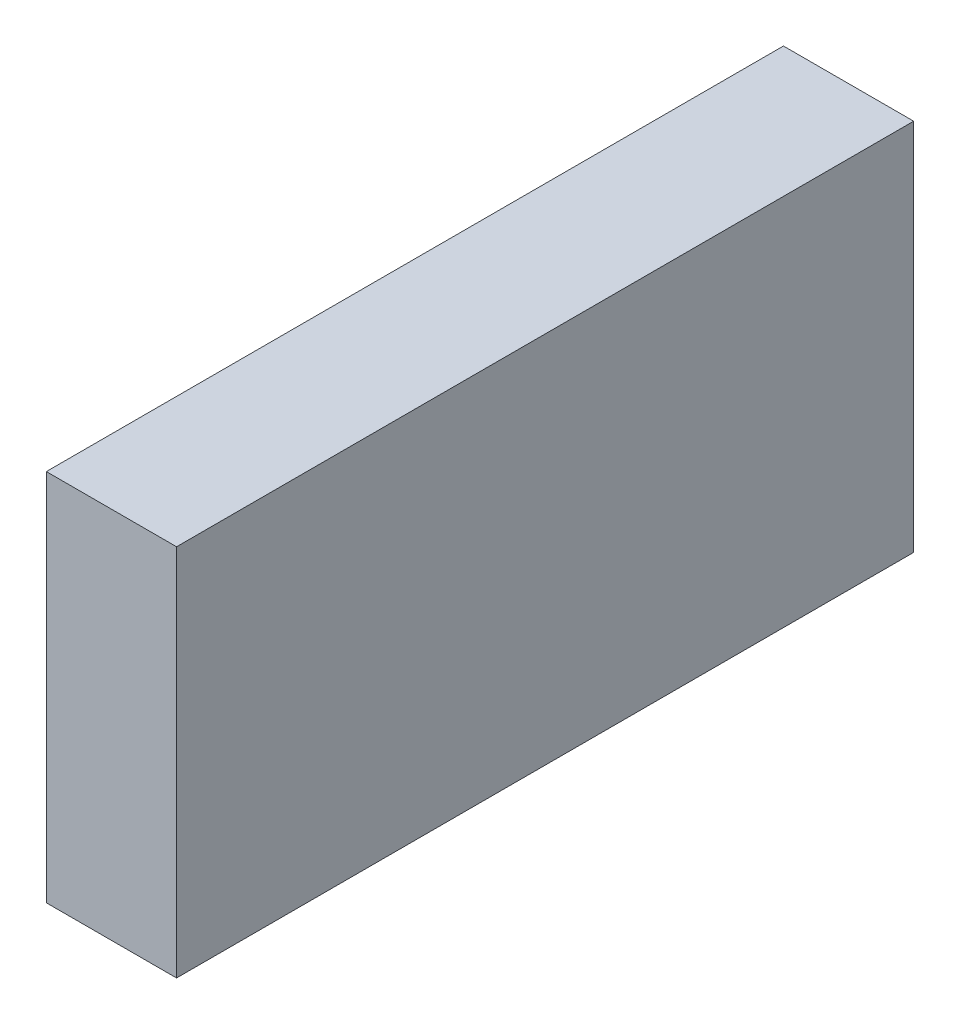
ISO-10303-21;
HEADER;
FILE_DESCRIPTION(('STEP AP214'),'2;1');
FILE_NAME('part.step','',(''),(''),'','','');
FILE_SCHEMA(('AUTOMOTIVE_DESIGN { 1 0 10303 214 1 1 1 1 }'));
ENDSEC;
DATA;
#1=APPLICATION_CONTEXT('core data for automotive mechanical design processes');
#2=APPLICATION_PROTOCOL_DEFINITION('international standard','automotive_design',2000,#1);
#3=PRODUCT_CONTEXT('',#1,'mechanical');
#4=PRODUCT('Part','Part','',(#3));
#5=PRODUCT_RELATED_PRODUCT_CATEGORY('part','',(#4));
#6=PRODUCT_DEFINITION_FORMATION('','',#4);
#7=PRODUCT_DEFINITION_CONTEXT('part definition',#1,'design');
#8=PRODUCT_DEFINITION('design','',#6,#7);
#9=PRODUCT_DEFINITION_SHAPE('','',#8);
#10=(LENGTH_UNIT() NAMED_UNIT(*) SI_UNIT(.MILLI.,.METRE.));
#11=(NAMED_UNIT(*) PLANE_ANGLE_UNIT() SI_UNIT($,.RADIAN.));
#12=(NAMED_UNIT(*) SI_UNIT($,.STERADIAN.) SOLID_ANGLE_UNIT());
#13=UNCERTAINTY_MEASURE_WITH_UNIT(LENGTH_MEASURE(1.E-05),#10,'distance_accuracy_value','');
#14=(GEOMETRIC_REPRESENTATION_CONTEXT(3) GLOBAL_UNCERTAINTY_ASSIGNED_CONTEXT((#13)) GLOBAL_UNIT_ASSIGNED_CONTEXT((#10,
#11,#12)) REPRESENTATION_CONTEXT('',''));
#15=CARTESIAN_POINT('',(0.,0.,0.));
#16=DIRECTION('',(0.,0.,1.));
#17=DIRECTION('',(1.,0.,0.));
#18=AXIS2_PLACEMENT_3D('',#15,#16,#17);
#19=CARTESIAN_POINT('',(0.26500074,-0.76000102,0.));
#20=DIRECTION('',(-1.,0.,0.));
#21=DIRECTION('',(0.,1.,0.));
#22=AXIS2_PLACEMENT_3D('',#19,#20,#21);
#23=PLANE('',#22);
#24=DIRECTION('',(0.,1.,0.));
#25=VECTOR('',#24,1.);
#26=CARTESIAN_POINT('',(0.26500074,-0.76000102,0.));
#27=LINE('',#26,#25);
#28=CARTESIAN_POINT('',(0.26500074,-0.76000102,0.));
#29=VERTEX_POINT('',#28);
#30=CARTESIAN_POINT('',(0.26500074,0.76000102,0.));
#31=VERTEX_POINT('',#30);
#32=EDGE_CURVE('E11',#29,#31,#27,.T.);
#33=ORIENTED_EDGE('',*,*,#32,.T.);
#34=DIRECTION('',(0.,0.,1.));
#35=VECTOR('',#34,1.);
#36=CARTESIAN_POINT('',(0.26500074,0.76000102,0.));
#37=LINE('',#36,#35);
#38=CARTESIAN_POINT('',(0.26500074,0.76000102,2.99999908));
#39=VERTEX_POINT('',#38);
#40=EDGE_CURVE('E24',#31,#39,#37,.T.);
#41=ORIENTED_EDGE('',*,*,#40,.T.);
#42=DIRECTION('',(0.,1.,0.));
#43=VECTOR('',#42,1.);
#44=CARTESIAN_POINT('',(0.26500074,-0.76000102,2.99999908));
#45=LINE('',#44,#43);
#46=CARTESIAN_POINT('',(0.26500074,-0.76000102,2.99999908));
#47=VERTEX_POINT('',#46);
#48=EDGE_CURVE('E87',#47,#39,#45,.T.);
#49=ORIENTED_EDGE('',*,*,#48,.F.);
#50=DIRECTION('',(0.,0.,1.));
#51=VECTOR('',#50,1.);
#52=CARTESIAN_POINT('',(0.26500074,-0.76000102,0.));
#53=LINE('',#52,#51);
#54=EDGE_CURVE('E36',#29,#47,#53,.T.);
#55=ORIENTED_EDGE('',*,*,#54,.F.);
#56=EDGE_LOOP('',(#33,#41,#49,#55));
#57=FACE_BOUND('',#56,.T.);
#58=ADVANCED_FACE('F17',(#57),#23,.F.);
#59=CARTESIAN_POINT('',(0.26500074,0.76000102,0.));
#60=DIRECTION('',(0.,-1.,0.));
#61=DIRECTION('',(-1.,0.,0.));
#62=AXIS2_PLACEMENT_3D('',#59,#60,#61);
#63=PLANE('',#62);
#64=DIRECTION('',(-1.,0.,0.));
#65=VECTOR('',#64,1.);
#66=CARTESIAN_POINT('',(0.26500074,0.76000102,0.));
#67=LINE('',#66,#65);
#68=CARTESIAN_POINT('',(-0.26500074,0.76000102,0.));
#69=VERTEX_POINT('',#68);
#70=EDGE_CURVE('E84',#31,#69,#67,.T.);
#71=ORIENTED_EDGE('',*,*,#70,.T.);
#72=DIRECTION('',(0.,0.,1.));
#73=VECTOR('',#72,1.);
#74=CARTESIAN_POINT('',(-0.26500074,0.76000102,0.));
#75=LINE('',#74,#73);
#76=CARTESIAN_POINT('',(-0.26500074,0.76000102,2.99999908));
#77=VERTEX_POINT('',#76);
#78=EDGE_CURVE('E82',#69,#77,#75,.T.);
#79=ORIENTED_EDGE('',*,*,#78,.T.);
#80=DIRECTION('',(-1.,0.,0.));
#81=VECTOR('',#80,1.);
#82=CARTESIAN_POINT('',(0.26500074,0.76000102,2.99999908));
#83=LINE('',#82,#81);
#84=EDGE_CURVE('E62',#39,#77,#83,.T.);
#85=ORIENTED_EDGE('',*,*,#84,.F.);
#86=ORIENTED_EDGE('',*,*,#40,.F.);
#87=EDGE_LOOP('',(#71,#79,#85,#86));
#88=FACE_BOUND('',#87,.T.);
#89=ADVANCED_FACE('F89',(#88),#63,.F.);
#90=CARTESIAN_POINT('',(-0.26500074,0.76000102,0.));
#91=DIRECTION('',(1.,0.,0.));
#92=DIRECTION('',(0.,-1.,0.));
#93=AXIS2_PLACEMENT_3D('',#90,#91,#92);
#94=PLANE('',#93);
#95=DIRECTION('',(0.,-1.,0.));
#96=VECTOR('',#95,1.);
#97=CARTESIAN_POINT('',(-0.26500074,0.76000102,0.));
#98=LINE('',#97,#96);
#99=CARTESIAN_POINT('',(-0.26500074,-0.76000102,0.));
#100=VERTEX_POINT('',#99);
#101=EDGE_CURVE('E71',#69,#100,#98,.T.);
#102=ORIENTED_EDGE('',*,*,#101,.T.);
#103=DIRECTION('',(0.,0.,1.));
#104=VECTOR('',#103,1.);
#105=CARTESIAN_POINT('',(-0.26500074,-0.76000102,0.));
#106=LINE('',#105,#104);
#107=CARTESIAN_POINT('',(-0.26500074,-0.76000102,2.99999908));
#108=VERTEX_POINT('',#107);
#109=EDGE_CURVE('E65',#100,#108,#106,.T.);
#110=ORIENTED_EDGE('',*,*,#109,.T.);
#111=DIRECTION('',(0.,-1.,0.));
#112=VECTOR('',#111,1.);
#113=CARTESIAN_POINT('',(-0.26500074,0.76000102,2.99999908));
#114=LINE('',#113,#112);
#115=EDGE_CURVE('E57',#77,#108,#114,.T.);
#116=ORIENTED_EDGE('',*,*,#115,.F.);
#117=ORIENTED_EDGE('',*,*,#78,.F.);
#118=EDGE_LOOP('',(#102,#110,#116,#117));
#119=FACE_BOUND('',#118,.T.);
#120=ADVANCED_FACE('F69',(#119),#94,.F.);
#121=CARTESIAN_POINT('',(-0.26500074,-0.76000102,0.));
#122=DIRECTION('',(0.,1.,0.));
#123=DIRECTION('',(1.,0.,0.));
#124=AXIS2_PLACEMENT_3D('',#121,#122,#123);
#125=PLANE('',#124);
#126=DIRECTION('',(1.,0.,0.));
#127=VECTOR('',#126,1.);
#128=CARTESIAN_POINT('',(-0.26500074,-0.76000102,0.));
#129=LINE('',#128,#127);
#130=EDGE_CURVE('E66',#100,#29,#129,.T.);
#131=ORIENTED_EDGE('',*,*,#130,.T.);
#132=ORIENTED_EDGE('',*,*,#54,.T.);
#133=DIRECTION('',(1.,0.,0.));
#134=VECTOR('',#133,1.);
#135=CARTESIAN_POINT('',(-0.26500074,-0.76000102,2.99999908));
#136=LINE('',#135,#134);
#137=EDGE_CURVE('E61',#108,#47,#136,.T.);
#138=ORIENTED_EDGE('',*,*,#137,.F.);
#139=ORIENTED_EDGE('',*,*,#109,.F.);
#140=EDGE_LOOP('',(#131,#132,#138,#139));
#141=FACE_BOUND('',#140,.T.);
#142=ADVANCED_FACE('F76',(#141),#125,.F.);
#143=CARTESIAN_POINT('',(0.,0.,0.));
#144=DIRECTION('',(0.,0.,1.));
#145=DIRECTION('',(1.,0.,0.));
#146=AXIS2_PLACEMENT_3D('',#143,#144,#145);
#147=PLANE('',#146);
#148=ORIENTED_EDGE('',*,*,#130,.F.);
#149=ORIENTED_EDGE('',*,*,#101,.F.);
#150=ORIENTED_EDGE('',*,*,#70,.F.);
#151=ORIENTED_EDGE('',*,*,#32,.F.);
#152=EDGE_LOOP('',(#148,#149,#150,#151));
#153=FACE_BOUND('',#152,.T.);
#154=ADVANCED_FACE('F91',(#153),#147,.F.);
#155=CARTESIAN_POINT('',(0.,0.,2.99999908));
#156=DIRECTION('',(0.,0.,1.));
#157=DIRECTION('',(1.,0.,0.));
#158=AXIS2_PLACEMENT_3D('',#155,#156,#157);
#159=PLANE('',#158);
#160=ORIENTED_EDGE('',*,*,#48,.T.);
#161=ORIENTED_EDGE('',*,*,#84,.T.);
#162=ORIENTED_EDGE('',*,*,#115,.T.);
#163=ORIENTED_EDGE('',*,*,#137,.T.);
#164=EDGE_LOOP('',(#160,#161,#162,#163));
#165=FACE_BOUND('',#164,.T.);
#166=ADVANCED_FACE('F59',(#165),#159,.T.);
#167=CLOSED_SHELL('',(#58,#89,#120,#142,#154,#166));
#168=MANIFOLD_SOLID_BREP('B1',#167);
#169=ADVANCED_BREP_SHAPE_REPRESENTATION('',(#18,#168),#14);
#170=SHAPE_DEFINITION_REPRESENTATION(#9,#169);
ENDSEC;
END-ISO-10303-21;
